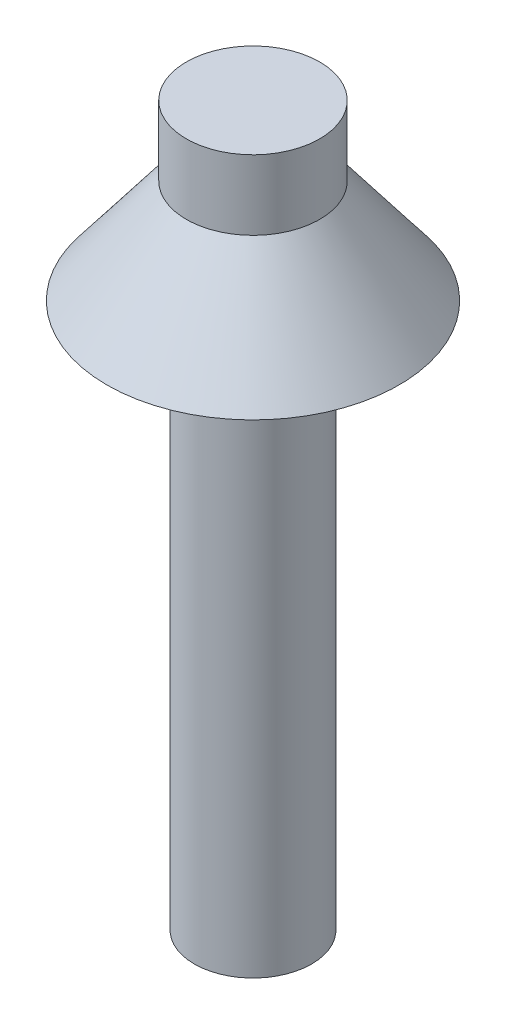
ISO-10303-21;
HEADER;
FILE_DESCRIPTION(('STEP AP214'),'2;1');
FILE_NAME('part.step','',(''),(''),'','','');
FILE_SCHEMA(('AUTOMOTIVE_DESIGN { 1 0 10303 214 1 1 1 1 }'));
ENDSEC;
DATA;
#1=APPLICATION_CONTEXT('core data for automotive mechanical design processes');
#2=APPLICATION_PROTOCOL_DEFINITION('international standard','automotive_design',2000,#1);
#3=PRODUCT_CONTEXT('',#1,'mechanical');
#4=PRODUCT('Part','Part','',(#3));
#5=PRODUCT_RELATED_PRODUCT_CATEGORY('part','',(#4));
#6=PRODUCT_DEFINITION_FORMATION('','',#4);
#7=PRODUCT_DEFINITION_CONTEXT('part definition',#1,'design');
#8=PRODUCT_DEFINITION('design','',#6,#7);
#9=PRODUCT_DEFINITION_SHAPE('','',#8);
#10=(LENGTH_UNIT() NAMED_UNIT(*) SI_UNIT(.MILLI.,.METRE.));
#11=(NAMED_UNIT(*) PLANE_ANGLE_UNIT() SI_UNIT($,.RADIAN.));
#12=(NAMED_UNIT(*) SI_UNIT($,.STERADIAN.) SOLID_ANGLE_UNIT());
#13=UNCERTAINTY_MEASURE_WITH_UNIT(LENGTH_MEASURE(1.E-05),#10,'distance_accuracy_value','');
#14=(GEOMETRIC_REPRESENTATION_CONTEXT(3) GLOBAL_UNCERTAINTY_ASSIGNED_CONTEXT((#13)) GLOBAL_UNIT_ASSIGNED_CONTEXT((#10,
#11,#12)) REPRESENTATION_CONTEXT('',''));
#15=CARTESIAN_POINT('',(0.,0.,0.));
#16=DIRECTION('',(0.,0.,1.));
#17=DIRECTION('',(1.,0.,0.));
#18=AXIS2_PLACEMENT_3D('',#15,#16,#17);
#19=CARTESIAN_POINT('',(0.,278.939208480935,0.));
#20=DIRECTION('',(0.,-1.,0.));
#21=DIRECTION('',(0.,0.,-1.));
#22=AXIS2_PLACEMENT_3D('',#19,#20,#21);
#23=CYLINDRICAL_SURFACE('',#22,34.1086897729497);
#24=CARTESIAN_POINT('',(0.,367.659164194002,0.));
#25=DIRECTION('',(0.,-1.,0.));
#26=DIRECTION('',(0.,0.,-1.));
#27=AXIS2_PLACEMENT_3D('',#24,#25,#26);
#28=CIRCLE('',#27,34.1086897729497);
#29=CARTESIAN_POINT('',(0.,367.659164194002,-34.1086897729497));
#30=VERTEX_POINT('',#29);
#31=EDGE_CURVE('E53',#30,#30,#28,.T.);
#32=ORIENTED_EDGE('',*,*,#31,.T.);
#33=EDGE_LOOP('',(#32));
#34=FACE_BOUND('',#33,.T.);
#35=CARTESIAN_POINT('',(0.,331.961419561169,0.));
#36=DIRECTION('',(0.,-1.,0.));
#37=DIRECTION('',(0.,0.,-1.));
#38=AXIS2_PLACEMENT_3D('',#35,#36,#37);
#39=CIRCLE('',#38,34.1086897729497);
#40=CARTESIAN_POINT('',(0.,331.961419561169,-34.1086897729497));
#41=VERTEX_POINT('',#40);
#42=EDGE_CURVE('E46',#41,#41,#39,.T.);
#43=ORIENTED_EDGE('',*,*,#42,.F.);
#44=EDGE_LOOP('',(#43));
#45=FACE_BOUND('',#44,.T.);
#46=ADVANCED_FACE('F35',(#34,#45),#23,.T.);
#47=CARTESIAN_POINT('',(0.,278.939208480935,0.));
#48=DIRECTION('',(0.,-1.,0.));
#49=DIRECTION('',(0.,0.,-1.));
#50=AXIS2_PLACEMENT_3D('',#47,#48,#49);
#51=CONICAL_SURFACE('',#50,74.7590516011288,0.654082724414361);
#52=ORIENTED_EDGE('',*,*,#42,.T.);
#53=EDGE_LOOP('',(#52));
#54=FACE_BOUND('',#53,.T.);
#55=CARTESIAN_POINT('',(0.,278.939208480935,0.));
#56=DIRECTION('',(0.,-1.,0.));
#57=DIRECTION('',(0.,0.,-1.));
#58=AXIS2_PLACEMENT_3D('',#55,#56,#57);
#59=CIRCLE('',#58,74.7590516011288);
#60=CARTESIAN_POINT('',(0.,278.939208480935,-74.7590516011288));
#61=VERTEX_POINT('',#60);
#62=EDGE_CURVE('E50',#61,#61,#59,.T.);
#63=ORIENTED_EDGE('',*,*,#62,.F.);
#64=EDGE_LOOP('',(#63));
#65=FACE_BOUND('',#64,.T.);
#66=ADVANCED_FACE('F69',(#54,#65),#51,.T.);
#67=CARTESIAN_POINT('',(74.7590516011288,278.939208480935,0.));
#68=DIRECTION('',(0.,-1.,0.));
#69=DIRECTION('',(0.,0.,-1.));
#70=AXIS2_PLACEMENT_3D('',#67,#68,#69);
#71=PLANE('',#70);
#72=CARTESIAN_POINT('',(0.,278.939208480935,0.));
#73=DIRECTION('',(0.,-1.,0.));
#74=DIRECTION('',(0.,0.,-1.));
#75=AXIS2_PLACEMENT_3D('',#72,#73,#74);
#76=CIRCLE('',#75,30.);
#77=CARTESIAN_POINT('',(0.,278.939208480935,-30.));
#78=VERTEX_POINT('',#77);
#79=EDGE_CURVE('E39',#78,#78,#76,.T.);
#80=ORIENTED_EDGE('',*,*,#79,.F.);
#81=EDGE_LOOP('',(#80));
#82=FACE_BOUND('',#81,.T.);
#83=ORIENTED_EDGE('',*,*,#62,.T.);
#84=EDGE_LOOP('',(#83));
#85=FACE_BOUND('',#84,.T.);
#86=ADVANCED_FACE('F61',(#82,#85),#71,.T.);
#87=CARTESIAN_POINT('',(0.,367.659164194002,0.));
#88=DIRECTION('',(0.,1.,0.));
#89=DIRECTION('',(0.,0.,1.));
#90=AXIS2_PLACEMENT_3D('',#87,#88,#89);
#91=PLANE('',#90);
#92=ORIENTED_EDGE('',*,*,#31,.F.);
#93=EDGE_LOOP('',(#92));
#94=FACE_BOUND('',#93,.T.);
#95=ADVANCED_FACE('F59',(#94),#91,.T.);
#96=CARTESIAN_POINT('',(0.,319.,0.));
#97=DIRECTION('',(0.,-1.,0.));
#98=DIRECTION('',(0.,0.,-1.));
#99=AXIS2_PLACEMENT_3D('',#96,#97,#98);
#100=CYLINDRICAL_SURFACE('',#99,30.);
#101=ORIENTED_EDGE('',*,*,#79,.T.);
#102=EDGE_LOOP('',(#101));
#103=FACE_BOUND('',#102,.T.);
#104=CARTESIAN_POINT('',(0.,0.,0.));
#105=DIRECTION('',(0.,1.,0.));
#106=DIRECTION('',(0.,0.,1.));
#107=AXIS2_PLACEMENT_3D('',#104,#105,#106);
#108=CIRCLE('',#107,30.);
#109=CARTESIAN_POINT('',(0.,0.,30.));
#110=VERTEX_POINT('',#109);
#111=EDGE_CURVE('E10',#110,#110,#108,.T.);
#112=ORIENTED_EDGE('',*,*,#111,.T.);
#113=EDGE_LOOP('',(#112));
#114=FACE_BOUND('',#113,.T.);
#115=ADVANCED_FACE('F37',(#103,#114),#100,.T.);
#116=CARTESIAN_POINT('',(0.,0.,0.));
#117=DIRECTION('',(0.,1.,0.));
#118=DIRECTION('',(0.,0.,1.));
#119=AXIS2_PLACEMENT_3D('',#116,#117,#118);
#120=PLANE('',#119);
#121=ORIENTED_EDGE('',*,*,#111,.F.);
#122=EDGE_LOOP('',(#121));
#123=FACE_BOUND('',#122,.T.);
#124=ADVANCED_FACE('F67',(#123),#120,.F.);
#125=CLOSED_SHELL('',(#46,#66,#86,#95,#115,#124));
#126=MANIFOLD_SOLID_BREP('B2',#125);
#127=ADVANCED_BREP_SHAPE_REPRESENTATION('',(#18,#126),#14);
#128=SHAPE_DEFINITION_REPRESENTATION(#9,#127);
ENDSEC;
END-ISO-10303-21;
